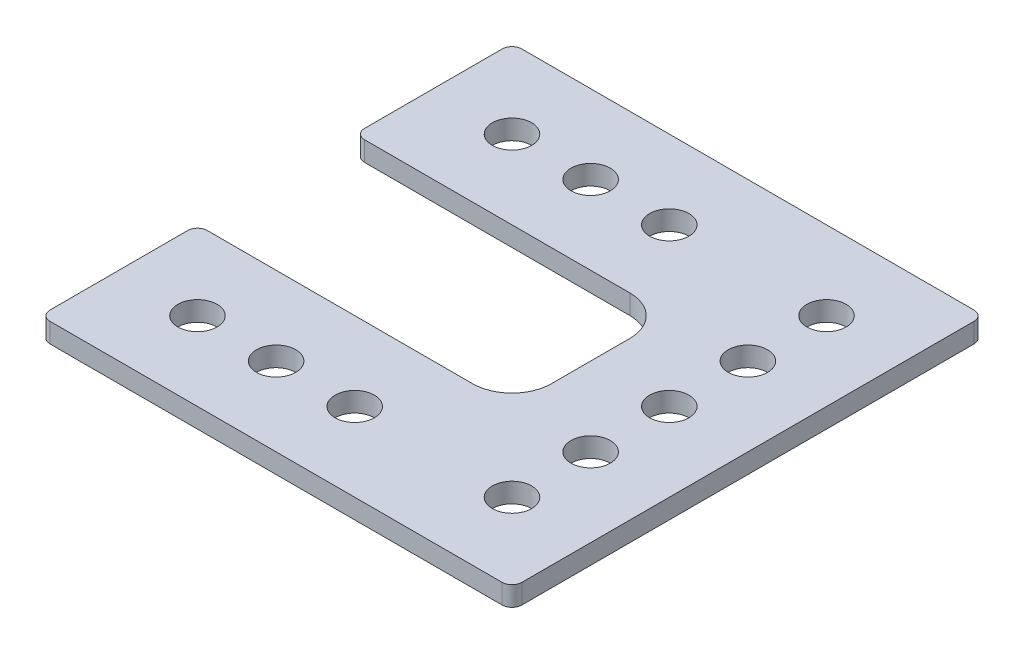
ISO-10303-21;
HEADER;
FILE_DESCRIPTION(('STEP AP214'),'2;1');
FILE_NAME('part.step','',(''),(''),'','','');
FILE_SCHEMA(('AUTOMOTIVE_DESIGN { 1 0 10303 214 1 1 1 1 }'));
ENDSEC;
DATA;
#1=APPLICATION_CONTEXT('core data for automotive mechanical design processes');
#2=APPLICATION_PROTOCOL_DEFINITION('international standard','automotive_design',2000,#1);
#3=PRODUCT_CONTEXT('',#1,'mechanical');
#4=PRODUCT('Part','Part','',(#3));
#5=PRODUCT_RELATED_PRODUCT_CATEGORY('part','',(#4));
#6=PRODUCT_DEFINITION_FORMATION('','',#4);
#7=PRODUCT_DEFINITION_CONTEXT('part definition',#1,'design');
#8=PRODUCT_DEFINITION('design','',#6,#7);
#9=PRODUCT_DEFINITION_SHAPE('','',#8);
#10=(LENGTH_UNIT() NAMED_UNIT(*) SI_UNIT(.MILLI.,.METRE.));
#11=(NAMED_UNIT(*) PLANE_ANGLE_UNIT() SI_UNIT($,.RADIAN.));
#12=(NAMED_UNIT(*) SI_UNIT($,.STERADIAN.) SOLID_ANGLE_UNIT());
#13=UNCERTAINTY_MEASURE_WITH_UNIT(LENGTH_MEASURE(1.E-05),#10,'distance_accuracy_value','');
#14=(GEOMETRIC_REPRESENTATION_CONTEXT(3) GLOBAL_UNCERTAINTY_ASSIGNED_CONTEXT((#13)) GLOBAL_UNIT_ASSIGNED_CONTEXT((#10,
#11,#12)) REPRESENTATION_CONTEXT('',''));
#15=CARTESIAN_POINT('',(0.,0.,0.));
#16=DIRECTION('',(0.,0.,1.));
#17=DIRECTION('',(1.,0.,0.));
#18=AXIS2_PLACEMENT_3D('',#15,#16,#17);
#19=CARTESIAN_POINT('',(12.7,3.175,38.1));
#20=DIRECTION('',(-1.,0.,0.));
#21=DIRECTION('',(0.,0.,1.));
#22=AXIS2_PLACEMENT_3D('',#19,#20,#21);
#23=PLANE('',#22);
#24=DIRECTION('',(0.,0.,-1.));
#25=VECTOR('',#24,1.);
#26=CARTESIAN_POINT('',(12.7,3.175,38.1));
#27=LINE('',#26,#25);
#28=CARTESIAN_POINT('',(12.7,3.175,36.5125));
#29=VERTEX_POINT('',#28);
#30=CARTESIAN_POINT('',(12.7,3.175,-36.5125));
#31=VERTEX_POINT('',#30);
#32=EDGE_CURVE('E166',#29,#31,#27,.T.);
#33=ORIENTED_EDGE('',*,*,#32,.F.);
#34=DIRECTION('',(0.,-1.,0.));
#35=VECTOR('',#34,1.);
#36=CARTESIAN_POINT('',(12.7,3.175,36.5125));
#37=LINE('',#36,#35);
#38=CARTESIAN_POINT('',(12.7,0.,36.5125));
#39=VERTEX_POINT('',#38);
#40=EDGE_CURVE('E152',#29,#39,#37,.T.);
#41=ORIENTED_EDGE('',*,*,#40,.T.);
#42=DIRECTION('',(0.,0.,-1.));
#43=VECTOR('',#42,1.);
#44=CARTESIAN_POINT('',(12.7,0.,38.1));
#45=LINE('',#44,#43);
#46=CARTESIAN_POINT('',(12.7,0.,-36.5125));
#47=VERTEX_POINT('',#46);
#48=EDGE_CURVE('E163',#39,#47,#45,.T.);
#49=ORIENTED_EDGE('',*,*,#48,.T.);
#50=DIRECTION('',(0.,-1.,0.));
#51=VECTOR('',#50,1.);
#52=CARTESIAN_POINT('',(12.7,3.175,-36.5125));
#53=LINE('',#52,#51);
#54=EDGE_CURVE('E168',#47,#31,#53,.F.);
#55=ORIENTED_EDGE('',*,*,#54,.T.);
#56=EDGE_LOOP('',(#33,#41,#49,#55));
#57=FACE_BOUND('',#56,.T.);
#58=ADVANCED_FACE('F35',(#57),#23,.F.);
#59=CARTESIAN_POINT('',(-63.5,3.175,-38.1));
#60=DIRECTION('',(0.,0.,1.));
#61=DIRECTION('',(1.,0.,0.));
#62=AXIS2_PLACEMENT_3D('',#59,#60,#61);
#63=PLANE('',#62);
#64=DIRECTION('',(-1.,0.,0.));
#65=VECTOR('',#64,1.);
#66=CARTESIAN_POINT('',(-12.7,3.175,-38.1));
#67=LINE('',#66,#65);
#68=CARTESIAN_POINT('',(11.1125,3.175,-38.1));
#69=VERTEX_POINT('',#68);
#70=CARTESIAN_POINT('',(-61.9125,3.175,-38.1));
#71=VERTEX_POINT('',#70);
#72=EDGE_CURVE('E289',#69,#71,#67,.T.);
#73=ORIENTED_EDGE('',*,*,#72,.F.);
#74=DIRECTION('',(0.,-1.,0.));
#75=VECTOR('',#74,1.);
#76=CARTESIAN_POINT('',(11.1125,3.175,-38.1));
#77=LINE('',#76,#75);
#78=CARTESIAN_POINT('',(11.1125,0.,-38.1));
#79=VERTEX_POINT('',#78);
#80=EDGE_CURVE('E226',#69,#79,#77,.T.);
#81=ORIENTED_EDGE('',*,*,#80,.T.);
#82=DIRECTION('',(-1.,0.,0.));
#83=VECTOR('',#82,1.);
#84=CARTESIAN_POINT('',(-63.5,0.,-38.1));
#85=LINE('',#84,#83);
#86=CARTESIAN_POINT('',(-61.9125,0.,-38.1));
#87=VERTEX_POINT('',#86);
#88=EDGE_CURVE('E172',#79,#87,#85,.T.);
#89=ORIENTED_EDGE('',*,*,#88,.T.);
#90=DIRECTION('',(0.,-1.,0.));
#91=VECTOR('',#90,1.);
#92=CARTESIAN_POINT('',(-61.9125,3.175,-38.1));
#93=LINE('',#92,#91);
#94=EDGE_CURVE('E224',#87,#71,#93,.F.);
#95=ORIENTED_EDGE('',*,*,#94,.T.);
#96=EDGE_LOOP('',(#73,#81,#89,#95));
#97=FACE_BOUND('',#96,.T.);
#98=ADVANCED_FACE('F320',(#97),#63,.F.);
#99=CARTESIAN_POINT('',(-63.5,3.175,-12.7));
#100=DIRECTION('',(1.,0.,0.));
#101=DIRECTION('',(0.,0.,-1.));
#102=AXIS2_PLACEMENT_3D('',#99,#100,#101);
#103=PLANE('',#102);
#104=DIRECTION('',(0.,0.,1.));
#105=VECTOR('',#104,1.);
#106=CARTESIAN_POINT('',(-63.5,3.175,-12.7));
#107=LINE('',#106,#105);
#108=CARTESIAN_POINT('',(-63.5,3.175,-36.5125));
#109=VERTEX_POINT('',#108);
#110=CARTESIAN_POINT('',(-63.5,3.175,-14.2875));
#111=VERTEX_POINT('',#110);
#112=EDGE_CURVE('E286',#109,#111,#107,.T.);
#113=ORIENTED_EDGE('',*,*,#112,.F.);
#114=DIRECTION('',(0.,-1.,0.));
#115=VECTOR('',#114,1.);
#116=CARTESIAN_POINT('',(-63.5,3.175,-36.5125));
#117=LINE('',#116,#115);
#118=CARTESIAN_POINT('',(-63.5,0.,-36.5125));
#119=VERTEX_POINT('',#118);
#120=EDGE_CURVE('E231',#109,#119,#117,.T.);
#121=ORIENTED_EDGE('',*,*,#120,.T.);
#122=DIRECTION('',(0.,0.,1.));
#123=VECTOR('',#122,1.);
#124=CARTESIAN_POINT('',(-63.5,0.,-12.7));
#125=LINE('',#124,#123);
#126=CARTESIAN_POINT('',(-63.5,0.,-14.2875));
#127=VERTEX_POINT('',#126);
#128=EDGE_CURVE('E176',#119,#127,#125,.T.);
#129=ORIENTED_EDGE('',*,*,#128,.T.);
#130=DIRECTION('',(0.,-1.,0.));
#131=VECTOR('',#130,1.);
#132=CARTESIAN_POINT('',(-63.5,3.175,-14.2875));
#133=LINE('',#132,#131);
#134=EDGE_CURVE('E229',#127,#111,#133,.F.);
#135=ORIENTED_EDGE('',*,*,#134,.T.);
#136=EDGE_LOOP('',(#113,#121,#129,#135));
#137=FACE_BOUND('',#136,.T.);
#138=ADVANCED_FACE('F325',(#137),#103,.F.);
#139=CARTESIAN_POINT('',(-63.5,3.175,-12.7));
#140=DIRECTION('',(0.,0.,-1.));
#141=DIRECTION('',(-1.,0.,0.));
#142=AXIS2_PLACEMENT_3D('',#139,#140,#141);
#143=PLANE('',#142);
#144=DIRECTION('',(1.,0.,0.));
#145=VECTOR('',#144,1.);
#146=CARTESIAN_POINT('',(-63.5,0.,-12.7));
#147=LINE('',#146,#145);
#148=CARTESIAN_POINT('',(-61.9125,0.,-12.7));
#149=VERTEX_POINT('',#148);
#150=CARTESIAN_POINT('',(-19.05,0.,-12.7));
#151=VERTEX_POINT('',#150);
#152=EDGE_CURVE('E187',#149,#151,#147,.T.);
#153=ORIENTED_EDGE('',*,*,#152,.T.);
#154=DIRECTION('',(0.,-1.,0.));
#155=VECTOR('',#154,1.);
#156=CARTESIAN_POINT('',(-19.05,3.175,-12.7));
#157=LINE('',#156,#155);
#158=CARTESIAN_POINT('',(-19.05,3.175,-12.7));
#159=VERTEX_POINT('',#158);
#160=EDGE_CURVE('E56',#151,#159,#157,.F.);
#161=ORIENTED_EDGE('',*,*,#160,.T.);
#162=DIRECTION('',(1.,0.,0.));
#163=VECTOR('',#162,1.);
#164=CARTESIAN_POINT('',(-63.5,3.175,-12.7));
#165=LINE('',#164,#163);
#166=CARTESIAN_POINT('',(-61.9125,3.175,-12.7));
#167=VERTEX_POINT('',#166);
#168=EDGE_CURVE('E282',#167,#159,#165,.T.);
#169=ORIENTED_EDGE('',*,*,#168,.F.);
#170=DIRECTION('',(0.,-1.,0.));
#171=VECTOR('',#170,1.);
#172=CARTESIAN_POINT('',(-61.9125,3.175,-12.7));
#173=LINE('',#172,#171);
#174=EDGE_CURVE('E242',#167,#149,#173,.T.);
#175=ORIENTED_EDGE('',*,*,#174,.T.);
#176=EDGE_LOOP('',(#153,#161,#169,#175));
#177=FACE_BOUND('',#176,.T.);
#178=ADVANCED_FACE('F350',(#177),#143,.F.);
#179=CARTESIAN_POINT('',(-12.7,3.175,12.7));
#180=DIRECTION('',(1.,0.,0.));
#181=DIRECTION('',(0.,0.,-1.));
#182=AXIS2_PLACEMENT_3D('',#179,#180,#181);
#183=PLANE('',#182);
#184=DIRECTION('',(0.,0.,1.));
#185=VECTOR('',#184,1.);
#186=CARTESIAN_POINT('',(-12.7,0.,12.7));
#187=LINE('',#186,#185);
#188=CARTESIAN_POINT('',(-12.7,0.,-6.35000000000001));
#189=VERTEX_POINT('',#188);
#190=CARTESIAN_POINT('',(-12.7,0.,6.34999999999998));
#191=VERTEX_POINT('',#190);
#192=EDGE_CURVE('E189',#189,#191,#187,.T.);
#193=ORIENTED_EDGE('',*,*,#192,.T.);
#194=DIRECTION('',(0.,-1.,0.));
#195=VECTOR('',#194,1.);
#196=CARTESIAN_POINT('',(-12.7,3.175,6.34999999999998));
#197=LINE('',#196,#195);
#198=CARTESIAN_POINT('',(-12.7,3.175,6.34999999999998));
#199=VERTEX_POINT('',#198);
#200=EDGE_CURVE('E251',#191,#199,#197,.F.);
#201=ORIENTED_EDGE('',*,*,#200,.T.);
#202=DIRECTION('',(0.,0.,1.));
#203=VECTOR('',#202,1.);
#204=CARTESIAN_POINT('',(-12.7,3.175,12.7));
#205=LINE('',#204,#203);
#206=CARTESIAN_POINT('',(-12.7,3.175,-6.35000000000001));
#207=VERTEX_POINT('',#206);
#208=EDGE_CURVE('E265',#207,#199,#205,.T.);
#209=ORIENTED_EDGE('',*,*,#208,.F.);
#210=DIRECTION('',(0.,-1.,0.));
#211=VECTOR('',#210,1.);
#212=CARTESIAN_POINT('',(-12.7,0.,-6.35000000000001));
#213=LINE('',#212,#211);
#214=EDGE_CURVE('E248',#207,#189,#213,.T.);
#215=ORIENTED_EDGE('',*,*,#214,.T.);
#216=EDGE_LOOP('',(#193,#201,#209,#215));
#217=FACE_BOUND('',#216,.T.);
#218=ADVANCED_FACE('F278',(#217),#183,.F.);
#219=CARTESIAN_POINT('',(-63.5,3.175,12.7));
#220=DIRECTION('',(0.,0.,1.));
#221=DIRECTION('',(1.,0.,0.));
#222=AXIS2_PLACEMENT_3D('',#219,#220,#221);
#223=PLANE('',#222);
#224=DIRECTION('',(-1.,0.,0.));
#225=VECTOR('',#224,1.);
#226=CARTESIAN_POINT('',(-63.5,3.175,12.7));
#227=LINE('',#226,#225);
#228=CARTESIAN_POINT('',(-19.05,3.175,12.7));
#229=VERTEX_POINT('',#228);
#230=CARTESIAN_POINT('',(-61.9125,3.175,12.7));
#231=VERTEX_POINT('',#230);
#232=EDGE_CURVE('E263',#229,#231,#227,.T.);
#233=ORIENTED_EDGE('',*,*,#232,.F.);
#234=DIRECTION('',(0.,-1.,0.));
#235=VECTOR('',#234,1.);
#236=CARTESIAN_POINT('',(-19.05,0.,12.7));
#237=LINE('',#236,#235);
#238=CARTESIAN_POINT('',(-19.05,0.,12.7));
#239=VERTEX_POINT('',#238);
#240=EDGE_CURVE('E245',#229,#239,#237,.T.);
#241=ORIENTED_EDGE('',*,*,#240,.T.);
#242=DIRECTION('',(-1.,0.,0.));
#243=VECTOR('',#242,1.);
#244=CARTESIAN_POINT('',(-63.5,0.,12.7));
#245=LINE('',#244,#243);
#246=CARTESIAN_POINT('',(-61.9125,0.,12.7));
#247=VERTEX_POINT('',#246);
#248=EDGE_CURVE('E192',#239,#247,#245,.T.);
#249=ORIENTED_EDGE('',*,*,#248,.T.);
#250=DIRECTION('',(0.,-1.,0.));
#251=VECTOR('',#250,1.);
#252=CARTESIAN_POINT('',(-61.9125,3.175,12.7));
#253=LINE('',#252,#251);
#254=EDGE_CURVE('E239',#247,#231,#253,.F.);
#255=ORIENTED_EDGE('',*,*,#254,.T.);
#256=EDGE_LOOP('',(#233,#241,#249,#255));
#257=FACE_BOUND('',#256,.T.);
#258=ADVANCED_FACE('F270',(#257),#223,.F.);
#259=CARTESIAN_POINT('',(-63.5,3.175,12.7));
#260=DIRECTION('',(1.,0.,0.));
#261=DIRECTION('',(0.,0.,-1.));
#262=AXIS2_PLACEMENT_3D('',#259,#260,#261);
#263=PLANE('',#262);
#264=DIRECTION('',(0.,0.,1.));
#265=VECTOR('',#264,1.);
#266=CARTESIAN_POINT('',(-63.5,0.,12.7));
#267=LINE('',#266,#265);
#268=CARTESIAN_POINT('',(-63.5,0.,14.2875));
#269=VERTEX_POINT('',#268);
#270=CARTESIAN_POINT('',(-63.5,0.,36.5125));
#271=VERTEX_POINT('',#270);
#272=EDGE_CURVE('E194',#269,#271,#267,.T.);
#273=ORIENTED_EDGE('',*,*,#272,.T.);
#274=DIRECTION('',(0.,-1.,0.));
#275=VECTOR('',#274,1.);
#276=CARTESIAN_POINT('',(-63.5,3.175,36.5125));
#277=LINE('',#276,#275);
#278=CARTESIAN_POINT('',(-63.5,3.175,36.5125));
#279=VERTEX_POINT('',#278);
#280=EDGE_CURVE('E237',#271,#279,#277,.F.);
#281=ORIENTED_EDGE('',*,*,#280,.T.);
#282=DIRECTION('',(0.,0.,1.));
#283=VECTOR('',#282,1.);
#284=CARTESIAN_POINT('',(-63.5,3.175,12.7));
#285=LINE('',#284,#283);
#286=CARTESIAN_POINT('',(-63.5,3.175,14.2875));
#287=VERTEX_POINT('',#286);
#288=EDGE_CURVE('E274',#287,#279,#285,.T.);
#289=ORIENTED_EDGE('',*,*,#288,.F.);
#290=DIRECTION('',(0.,-1.,0.));
#291=VECTOR('',#290,1.);
#292=CARTESIAN_POINT('',(-63.5,3.175,14.2875));
#293=LINE('',#292,#291);
#294=EDGE_CURVE('E234',#287,#269,#293,.T.);
#295=ORIENTED_EDGE('',*,*,#294,.T.);
#296=EDGE_LOOP('',(#273,#281,#289,#295));
#297=FACE_BOUND('',#296,.T.);
#298=ADVANCED_FACE('F304',(#297),#263,.F.);
#299=CARTESIAN_POINT('',(-12.7,3.175,38.1));
#300=DIRECTION('',(0.,0.,-1.));
#301=DIRECTION('',(-1.,0.,0.));
#302=AXIS2_PLACEMENT_3D('',#299,#300,#301);
#303=PLANE('',#302);
#304=DIRECTION('',(1.,0.,0.));
#305=VECTOR('',#304,1.);
#306=CARTESIAN_POINT('',(-12.7,0.,38.1));
#307=LINE('',#306,#305);
#308=CARTESIAN_POINT('',(-61.9125,0.,38.1));
#309=VERTEX_POINT('',#308);
#310=CARTESIAN_POINT('',(11.1125,0.,38.1));
#311=VERTEX_POINT('',#310);
#312=EDGE_CURVE('E197',#309,#311,#307,.T.);
#313=ORIENTED_EDGE('',*,*,#312,.T.);
#314=DIRECTION('',(0.,-1.,0.));
#315=VECTOR('',#314,1.);
#316=CARTESIAN_POINT('',(11.1125,3.175,38.1));
#317=LINE('',#316,#315);
#318=CARTESIAN_POINT('',(11.1125,3.175,38.1));
#319=VERTEX_POINT('',#318);
#320=EDGE_CURVE('E153',#311,#319,#317,.F.);
#321=ORIENTED_EDGE('',*,*,#320,.T.);
#322=DIRECTION('',(1.,0.,0.));
#323=VECTOR('',#322,1.);
#324=CARTESIAN_POINT('',(-63.5,3.175,38.1));
#325=LINE('',#324,#323);
#326=CARTESIAN_POINT('',(-61.9125,3.175,38.1));
#327=VERTEX_POINT('',#326);
#328=EDGE_CURVE('E182',#327,#319,#325,.T.);
#329=ORIENTED_EDGE('',*,*,#328,.F.);
#330=DIRECTION('',(0.,-1.,0.));
#331=VECTOR('',#330,1.);
#332=CARTESIAN_POINT('',(-61.9125,3.175,38.1));
#333=LINE('',#332,#331);
#334=EDGE_CURVE('E157',#327,#309,#333,.T.);
#335=ORIENTED_EDGE('',*,*,#334,.T.);
#336=EDGE_LOOP('',(#313,#321,#329,#335));
#337=FACE_BOUND('',#336,.T.);
#338=ADVANCED_FACE('F298',(#337),#303,.F.);
#339=CARTESIAN_POINT('',(0.,3.175,0.));
#340=DIRECTION('',(0.,-1.,0.));
#341=DIRECTION('',(0.,0.,-1.));
#342=AXIS2_PLACEMENT_3D('',#339,#340,#341);
#343=PLANE('',#342);
#344=CARTESIAN_POINT('',(-50.8,3.175,25.4));
#345=DIRECTION('',(0.,1.,0.));
#346=DIRECTION('',(0.,0.,-1.));
#347=AXIS2_PLACEMENT_3D('',#344,#345,#346);
#348=CIRCLE('',#347,3.175);
#349=CARTESIAN_POINT('',(-50.8,3.175,22.225));
#350=VERTEX_POINT('',#349);
#351=EDGE_CURVE('E412',#350,#350,#348,.T.);
#352=ORIENTED_EDGE('',*,*,#351,.F.);
#353=EDGE_LOOP('',(#352));
#354=FACE_BOUND('',#353,.T.);
#355=CARTESIAN_POINT('',(-38.1,3.175,25.4));
#356=DIRECTION('',(0.,1.,0.));
#357=DIRECTION('',(0.,0.,-1.));
#358=AXIS2_PLACEMENT_3D('',#355,#356,#357);
#359=CIRCLE('',#358,3.175);
#360=CARTESIAN_POINT('',(-38.1,3.175,22.225));
#361=VERTEX_POINT('',#360);
#362=EDGE_CURVE('E406',#361,#361,#359,.T.);
#363=ORIENTED_EDGE('',*,*,#362,.F.);
#364=EDGE_LOOP('',(#363));
#365=FACE_BOUND('',#364,.T.);
#366=CARTESIAN_POINT('',(-25.4,3.175,-25.4));
#367=DIRECTION('',(0.,1.,0.));
#368=DIRECTION('',(0.,0.,1.));
#369=AXIS2_PLACEMENT_3D('',#366,#367,#368);
#370=CIRCLE('',#369,3.175);
#371=CARTESIAN_POINT('',(-25.4,3.175,-22.225));
#372=VERTEX_POINT('',#371);
#373=EDGE_CURVE('E400',#372,#372,#370,.T.);
#374=ORIENTED_EDGE('',*,*,#373,.F.);
#375=EDGE_LOOP('',(#374));
#376=FACE_BOUND('',#375,.T.);
#377=CARTESIAN_POINT('',(-38.1,3.175,-25.4));
#378=DIRECTION('',(0.,1.,0.));
#379=DIRECTION('',(0.,0.,1.));
#380=AXIS2_PLACEMENT_3D('',#377,#378,#379);
#381=CIRCLE('',#380,3.175);
#382=CARTESIAN_POINT('',(-38.1,3.175,-22.225));
#383=VERTEX_POINT('',#382);
#384=EDGE_CURVE('E394',#383,#383,#381,.T.);
#385=ORIENTED_EDGE('',*,*,#384,.F.);
#386=EDGE_LOOP('',(#385));
#387=FACE_BOUND('',#386,.T.);
#388=CARTESIAN_POINT('',(-25.4,3.175,25.4));
#389=DIRECTION('',(0.,1.,0.));
#390=DIRECTION('',(0.,0.,-1.));
#391=AXIS2_PLACEMENT_3D('',#388,#389,#390);
#392=CIRCLE('',#391,3.175);
#393=CARTESIAN_POINT('',(-25.4,3.175,22.225));
#394=VERTEX_POINT('',#393);
#395=EDGE_CURVE('E388',#394,#394,#392,.T.);
#396=ORIENTED_EDGE('',*,*,#395,.F.);
#397=EDGE_LOOP('',(#396));
#398=FACE_BOUND('',#397,.T.);
#399=CARTESIAN_POINT('',(-50.8,3.175,-25.4));
#400=DIRECTION('',(0.,1.,0.));
#401=DIRECTION('',(0.,0.,1.));
#402=AXIS2_PLACEMENT_3D('',#399,#400,#401);
#403=CIRCLE('',#402,3.175);
#404=CARTESIAN_POINT('',(-50.8,3.175,-22.225));
#405=VERTEX_POINT('',#404);
#406=EDGE_CURVE('E382',#405,#405,#403,.T.);
#407=ORIENTED_EDGE('',*,*,#406,.F.);
#408=EDGE_LOOP('',(#407));
#409=FACE_BOUND('',#408,.T.);
#410=CARTESIAN_POINT('',(0.,3.175,12.7));
#411=DIRECTION('',(0.,1.,0.));
#412=DIRECTION('',(0.,0.,-1.));
#413=AXIS2_PLACEMENT_3D('',#410,#411,#412);
#414=CIRCLE('',#413,3.175);
#415=CARTESIAN_POINT('',(0.,3.175,9.52499999999997));
#416=VERTEX_POINT('',#415);
#417=EDGE_CURVE('E376',#416,#416,#414,.T.);
#418=ORIENTED_EDGE('',*,*,#417,.F.);
#419=EDGE_LOOP('',(#418));
#420=FACE_BOUND('',#419,.T.);
#421=CARTESIAN_POINT('',(0.,3.175,25.4));
#422=DIRECTION('',(0.,1.,0.));
#423=DIRECTION('',(0.,0.,-1.));
#424=AXIS2_PLACEMENT_3D('',#421,#422,#423);
#425=CIRCLE('',#424,3.175);
#426=CARTESIAN_POINT('',(0.,3.175,22.225));
#427=VERTEX_POINT('',#426);
#428=EDGE_CURVE('E370',#427,#427,#425,.T.);
#429=ORIENTED_EDGE('',*,*,#428,.F.);
#430=EDGE_LOOP('',(#429));
#431=FACE_BOUND('',#430,.T.);
#432=CARTESIAN_POINT('',(0.,3.175,-25.4));
#433=DIRECTION('',(0.,1.,0.));
#434=DIRECTION('',(0.,0.,1.));
#435=AXIS2_PLACEMENT_3D('',#432,#433,#434);
#436=CIRCLE('',#435,3.175);
#437=CARTESIAN_POINT('',(0.,3.175,-22.225));
#438=VERTEX_POINT('',#437);
#439=EDGE_CURVE('E364',#438,#438,#436,.T.);
#440=ORIENTED_EDGE('',*,*,#439,.F.);
#441=EDGE_LOOP('',(#440));
#442=FACE_BOUND('',#441,.T.);
#443=CARTESIAN_POINT('',(0.,3.175,-12.7));
#444=DIRECTION('',(0.,1.,0.));
#445=DIRECTION('',(0.,0.,1.));
#446=AXIS2_PLACEMENT_3D('',#443,#444,#445);
#447=CIRCLE('',#446,3.175);
#448=CARTESIAN_POINT('',(0.,3.175,-9.525));
#449=VERTEX_POINT('',#448);
#450=EDGE_CURVE('E358',#449,#449,#447,.T.);
#451=ORIENTED_EDGE('',*,*,#450,.F.);
#452=EDGE_LOOP('',(#451));
#453=FACE_BOUND('',#452,.T.);
#454=CARTESIAN_POINT('',(0.,3.175,0.));
#455=DIRECTION('',(0.,1.,0.));
#456=DIRECTION('',(0.,0.,1.));
#457=AXIS2_PLACEMENT_3D('',#454,#455,#456);
#458=CIRCLE('',#457,3.175);
#459=CARTESIAN_POINT('',(0.,3.175,3.175));
#460=VERTEX_POINT('',#459);
#461=EDGE_CURVE('E179',#460,#460,#458,.T.);
#462=ORIENTED_EDGE('',*,*,#461,.F.);
#463=EDGE_LOOP('',(#462));
#464=FACE_BOUND('',#463,.T.);
#465=ORIENTED_EDGE('',*,*,#328,.T.);
#466=CARTESIAN_POINT('',(11.1125,3.175,36.5125));
#467=DIRECTION('',(0.,-1.,0.));
#468=DIRECTION('',(0.,0.,-1.));
#469=AXIS2_PLACEMENT_3D('',#466,#467,#468);
#470=CIRCLE('',#469,1.5875);
#471=EDGE_CURVE('E222',#319,#29,#470,.F.);
#472=ORIENTED_EDGE('',*,*,#471,.T.);
#473=ORIENTED_EDGE('',*,*,#32,.T.);
#474=CARTESIAN_POINT('',(11.1125,3.175,-36.5125));
#475=DIRECTION('',(0.,-1.,0.));
#476=DIRECTION('',(0.,0.,-1.));
#477=AXIS2_PLACEMENT_3D('',#474,#475,#476);
#478=CIRCLE('',#477,1.5875);
#479=EDGE_CURVE('E220',#31,#69,#478,.F.);
#480=ORIENTED_EDGE('',*,*,#479,.T.);
#481=ORIENTED_EDGE('',*,*,#72,.T.);
#482=CARTESIAN_POINT('',(-61.9125,3.175,-36.5125));
#483=DIRECTION('',(0.,-1.,0.));
#484=DIRECTION('',(0.,0.,-1.));
#485=AXIS2_PLACEMENT_3D('',#482,#483,#484);
#486=CIRCLE('',#485,1.5875);
#487=EDGE_CURVE('E218',#71,#109,#486,.F.);
#488=ORIENTED_EDGE('',*,*,#487,.T.);
#489=ORIENTED_EDGE('',*,*,#112,.T.);
#490=CARTESIAN_POINT('',(-61.9125,3.175,-14.2875));
#491=DIRECTION('',(0.,-1.,0.));
#492=DIRECTION('',(0.,0.,-1.));
#493=AXIS2_PLACEMENT_3D('',#490,#491,#492);
#494=CIRCLE('',#493,1.5875);
#495=EDGE_CURVE('E212',#111,#167,#494,.F.);
#496=ORIENTED_EDGE('',*,*,#495,.T.);
#497=ORIENTED_EDGE('',*,*,#168,.T.);
#498=CARTESIAN_POINT('',(-19.05,3.175,-6.35000000000001));
#499=DIRECTION('',(0.,-1.,0.));
#500=DIRECTION('',(0.,0.,-1.));
#501=AXIS2_PLACEMENT_3D('',#498,#499,#500);
#502=CIRCLE('',#501,6.35);
#503=EDGE_CURVE('E11',#159,#207,#502,.T.);
#504=ORIENTED_EDGE('',*,*,#503,.T.);
#505=ORIENTED_EDGE('',*,*,#208,.T.);
#506=CARTESIAN_POINT('',(-19.05,3.175,6.34999999999998));
#507=DIRECTION('',(0.,-1.,0.));
#508=DIRECTION('',(0.,0.,-1.));
#509=AXIS2_PLACEMENT_3D('',#506,#507,#508);
#510=CIRCLE('',#509,6.35);
#511=EDGE_CURVE('E256',#199,#229,#510,.T.);
#512=ORIENTED_EDGE('',*,*,#511,.T.);
#513=ORIENTED_EDGE('',*,*,#232,.T.);
#514=CARTESIAN_POINT('',(-61.9125,3.175,14.2875));
#515=DIRECTION('',(0.,-1.,0.));
#516=DIRECTION('',(0.,0.,-1.));
#517=AXIS2_PLACEMENT_3D('',#514,#515,#516);
#518=CIRCLE('',#517,1.5875);
#519=EDGE_CURVE('E214',#231,#287,#518,.F.);
#520=ORIENTED_EDGE('',*,*,#519,.T.);
#521=ORIENTED_EDGE('',*,*,#288,.T.);
#522=CARTESIAN_POINT('',(-61.9125,3.175,36.5125));
#523=DIRECTION('',(0.,-1.,0.));
#524=DIRECTION('',(0.,0.,-1.));
#525=AXIS2_PLACEMENT_3D('',#522,#523,#524);
#526=CIRCLE('',#525,1.5875);
#527=EDGE_CURVE('E216',#279,#327,#526,.F.);
#528=ORIENTED_EDGE('',*,*,#527,.T.);
#529=EDGE_LOOP('',(#465,#472,#473,#480,#481,#488,#489,#496,#497,#504,#505,#512,#513,#520,#521,#528));
#530=FACE_BOUND('',#529,.T.);
#531=ADVANCED_FACE('F262',(#354,#365,#376,#387,#398,#409,#420,#431,#442,#453,#464,#530),#343,.F.);
#532=CARTESIAN_POINT('',(0.,0.,0.));
#533=DIRECTION('',(0.,-1.,0.));
#534=DIRECTION('',(0.,0.,-1.));
#535=AXIS2_PLACEMENT_3D('',#532,#533,#534);
#536=PLANE('',#535);
#537=CARTESIAN_POINT('',(-50.8,0.,25.4));
#538=DIRECTION('',(0.,1.,0.));
#539=DIRECTION('',(0.,0.,-1.));
#540=AXIS2_PLACEMENT_3D('',#537,#538,#539);
#541=CIRCLE('',#540,3.175);
#542=CARTESIAN_POINT('',(-50.8,0.,22.225));
#543=VERTEX_POINT('',#542);
#544=EDGE_CURVE('E409',#543,#543,#541,.T.);
#545=ORIENTED_EDGE('',*,*,#544,.T.);
#546=EDGE_LOOP('',(#545));
#547=FACE_BOUND('',#546,.T.);
#548=CARTESIAN_POINT('',(-38.1,0.,25.4));
#549=DIRECTION('',(0.,1.,0.));
#550=DIRECTION('',(0.,0.,-1.));
#551=AXIS2_PLACEMENT_3D('',#548,#549,#550);
#552=CIRCLE('',#551,3.175);
#553=CARTESIAN_POINT('',(-38.1,0.,22.225));
#554=VERTEX_POINT('',#553);
#555=EDGE_CURVE('E403',#554,#554,#552,.T.);
#556=ORIENTED_EDGE('',*,*,#555,.T.);
#557=EDGE_LOOP('',(#556));
#558=FACE_BOUND('',#557,.T.);
#559=CARTESIAN_POINT('',(-25.4,0.,-25.4));
#560=DIRECTION('',(0.,1.,0.));
#561=DIRECTION('',(0.,0.,1.));
#562=AXIS2_PLACEMENT_3D('',#559,#560,#561);
#563=CIRCLE('',#562,3.175);
#564=CARTESIAN_POINT('',(-25.4,0.,-22.225));
#565=VERTEX_POINT('',#564);
#566=EDGE_CURVE('E397',#565,#565,#563,.T.);
#567=ORIENTED_EDGE('',*,*,#566,.T.);
#568=EDGE_LOOP('',(#567));
#569=FACE_BOUND('',#568,.T.);
#570=CARTESIAN_POINT('',(-38.1,0.,-25.4));
#571=DIRECTION('',(0.,1.,0.));
#572=DIRECTION('',(0.,0.,1.));
#573=AXIS2_PLACEMENT_3D('',#570,#571,#572);
#574=CIRCLE('',#573,3.175);
#575=CARTESIAN_POINT('',(-38.1,0.,-22.225));
#576=VERTEX_POINT('',#575);
#577=EDGE_CURVE('E391',#576,#576,#574,.T.);
#578=ORIENTED_EDGE('',*,*,#577,.T.);
#579=EDGE_LOOP('',(#578));
#580=FACE_BOUND('',#579,.T.);
#581=CARTESIAN_POINT('',(-25.4,0.,25.4));
#582=DIRECTION('',(0.,1.,0.));
#583=DIRECTION('',(0.,0.,-1.));
#584=AXIS2_PLACEMENT_3D('',#581,#582,#583);
#585=CIRCLE('',#584,3.175);
#586=CARTESIAN_POINT('',(-25.4,0.,22.225));
#587=VERTEX_POINT('',#586);
#588=EDGE_CURVE('E385',#587,#587,#585,.T.);
#589=ORIENTED_EDGE('',*,*,#588,.T.);
#590=EDGE_LOOP('',(#589));
#591=FACE_BOUND('',#590,.T.);
#592=CARTESIAN_POINT('',(-50.8,0.,-25.4));
#593=DIRECTION('',(0.,1.,0.));
#594=DIRECTION('',(0.,0.,1.));
#595=AXIS2_PLACEMENT_3D('',#592,#593,#594);
#596=CIRCLE('',#595,3.175);
#597=CARTESIAN_POINT('',(-50.8,0.,-22.225));
#598=VERTEX_POINT('',#597);
#599=EDGE_CURVE('E379',#598,#598,#596,.T.);
#600=ORIENTED_EDGE('',*,*,#599,.T.);
#601=EDGE_LOOP('',(#600));
#602=FACE_BOUND('',#601,.T.);
#603=CARTESIAN_POINT('',(0.,0.,12.7));
#604=DIRECTION('',(0.,1.,0.));
#605=DIRECTION('',(0.,0.,-1.));
#606=AXIS2_PLACEMENT_3D('',#603,#604,#605);
#607=CIRCLE('',#606,3.175);
#608=CARTESIAN_POINT('',(0.,0.,9.52499999999997));
#609=VERTEX_POINT('',#608);
#610=EDGE_CURVE('E373',#609,#609,#607,.T.);
#611=ORIENTED_EDGE('',*,*,#610,.T.);
#612=EDGE_LOOP('',(#611));
#613=FACE_BOUND('',#612,.T.);
#614=CARTESIAN_POINT('',(0.,0.,25.4));
#615=DIRECTION('',(0.,1.,0.));
#616=DIRECTION('',(0.,0.,-1.));
#617=AXIS2_PLACEMENT_3D('',#614,#615,#616);
#618=CIRCLE('',#617,3.175);
#619=CARTESIAN_POINT('',(0.,0.,22.225));
#620=VERTEX_POINT('',#619);
#621=EDGE_CURVE('E367',#620,#620,#618,.T.);
#622=ORIENTED_EDGE('',*,*,#621,.T.);
#623=EDGE_LOOP('',(#622));
#624=FACE_BOUND('',#623,.T.);
#625=CARTESIAN_POINT('',(0.,0.,-25.4));
#626=DIRECTION('',(0.,1.,0.));
#627=DIRECTION('',(0.,0.,1.));
#628=AXIS2_PLACEMENT_3D('',#625,#626,#627);
#629=CIRCLE('',#628,3.175);
#630=CARTESIAN_POINT('',(0.,0.,-22.225));
#631=VERTEX_POINT('',#630);
#632=EDGE_CURVE('E361',#631,#631,#629,.T.);
#633=ORIENTED_EDGE('',*,*,#632,.T.);
#634=EDGE_LOOP('',(#633));
#635=FACE_BOUND('',#634,.T.);
#636=CARTESIAN_POINT('',(0.,0.,-12.7));
#637=DIRECTION('',(0.,1.,0.));
#638=DIRECTION('',(0.,0.,1.));
#639=AXIS2_PLACEMENT_3D('',#636,#637,#638);
#640=CIRCLE('',#639,3.175);
#641=CARTESIAN_POINT('',(0.,0.,-9.525));
#642=VERTEX_POINT('',#641);
#643=EDGE_CURVE('E356',#642,#642,#640,.T.);
#644=ORIENTED_EDGE('',*,*,#643,.T.);
#645=EDGE_LOOP('',(#644));
#646=FACE_BOUND('',#645,.T.);
#647=CARTESIAN_POINT('',(0.,0.,0.));
#648=DIRECTION('',(0.,1.,0.));
#649=DIRECTION('',(0.,0.,1.));
#650=AXIS2_PLACEMENT_3D('',#647,#648,#649);
#651=CIRCLE('',#650,3.175);
#652=CARTESIAN_POINT('',(0.,0.,3.175));
#653=VERTEX_POINT('',#652);
#654=EDGE_CURVE('E173',#653,#653,#651,.T.);
#655=ORIENTED_EDGE('',*,*,#654,.T.);
#656=EDGE_LOOP('',(#655));
#657=FACE_BOUND('',#656,.T.);
#658=ORIENTED_EDGE('',*,*,#48,.F.);
#659=CARTESIAN_POINT('',(11.1125,0.,36.5125));
#660=DIRECTION('',(0.,-1.,0.));
#661=DIRECTION('',(0.,0.,-1.));
#662=AXIS2_PLACEMENT_3D('',#659,#660,#661);
#663=CIRCLE('',#662,1.5875);
#664=EDGE_CURVE('E148',#39,#311,#663,.T.);
#665=ORIENTED_EDGE('',*,*,#664,.T.);
#666=ORIENTED_EDGE('',*,*,#312,.F.);
#667=CARTESIAN_POINT('',(-61.9125,0.,36.5125));
#668=DIRECTION('',(0.,-1.,0.));
#669=DIRECTION('',(0.,0.,-1.));
#670=AXIS2_PLACEMENT_3D('',#667,#668,#669);
#671=CIRCLE('',#670,1.5875);
#672=EDGE_CURVE('E204',#309,#271,#671,.T.);
#673=ORIENTED_EDGE('',*,*,#672,.T.);
#674=ORIENTED_EDGE('',*,*,#272,.F.);
#675=CARTESIAN_POINT('',(-61.9125,0.,14.2875));
#676=DIRECTION('',(0.,-1.,0.));
#677=DIRECTION('',(0.,0.,-1.));
#678=AXIS2_PLACEMENT_3D('',#675,#676,#677);
#679=CIRCLE('',#678,1.5875);
#680=EDGE_CURVE('E201',#269,#247,#679,.T.);
#681=ORIENTED_EDGE('',*,*,#680,.T.);
#682=ORIENTED_EDGE('',*,*,#248,.F.);
#683=CARTESIAN_POINT('',(-19.05,0.,6.34999999999998));
#684=DIRECTION('',(0.,-1.,0.));
#685=DIRECTION('',(0.,0.,-1.));
#686=AXIS2_PLACEMENT_3D('',#683,#684,#685);
#687=CIRCLE('',#686,6.35);
#688=EDGE_CURVE('E254',#239,#191,#687,.F.);
#689=ORIENTED_EDGE('',*,*,#688,.T.);
#690=ORIENTED_EDGE('',*,*,#192,.F.);
#691=CARTESIAN_POINT('',(-19.05,0.,-6.35000000000001));
#692=DIRECTION('',(0.,-1.,0.));
#693=DIRECTION('',(0.,0.,-1.));
#694=AXIS2_PLACEMENT_3D('',#691,#692,#693);
#695=CIRCLE('',#694,6.35);
#696=EDGE_CURVE('E43',#189,#151,#695,.F.);
#697=ORIENTED_EDGE('',*,*,#696,.T.);
#698=ORIENTED_EDGE('',*,*,#152,.F.);
#699=CARTESIAN_POINT('',(-61.9125,0.,-14.2875));
#700=DIRECTION('',(0.,-1.,0.));
#701=DIRECTION('',(0.,0.,-1.));
#702=AXIS2_PLACEMENT_3D('',#699,#700,#701);
#703=CIRCLE('',#702,1.5875);
#704=EDGE_CURVE('E167',#149,#127,#703,.T.);
#705=ORIENTED_EDGE('',*,*,#704,.T.);
#706=ORIENTED_EDGE('',*,*,#128,.F.);
#707=CARTESIAN_POINT('',(-61.9125,0.,-36.5125));
#708=DIRECTION('',(0.,-1.,0.));
#709=DIRECTION('',(0.,0.,-1.));
#710=AXIS2_PLACEMENT_3D('',#707,#708,#709);
#711=CIRCLE('',#710,1.5875);
#712=EDGE_CURVE('E206',#119,#87,#711,.T.);
#713=ORIENTED_EDGE('',*,*,#712,.T.);
#714=ORIENTED_EDGE('',*,*,#88,.F.);
#715=CARTESIAN_POINT('',(11.1125,0.,-36.5125));
#716=DIRECTION('',(0.,-1.,0.));
#717=DIRECTION('',(0.,0.,-1.));
#718=AXIS2_PLACEMENT_3D('',#715,#716,#717);
#719=CIRCLE('',#718,1.5875);
#720=EDGE_CURVE('E158',#79,#47,#719,.T.);
#721=ORIENTED_EDGE('',*,*,#720,.T.);
#722=EDGE_LOOP('',(#658,#665,#666,#673,#674,#681,#682,#689,#690,#697,#698,#705,#706,#713,#714,#721));
#723=FACE_BOUND('',#722,.T.);
#724=ADVANCED_FACE('F170',(#547,#558,#569,#580,#591,#602,#613,#624,#635,#646,#657,#723),#536,.T.);
#725=CARTESIAN_POINT('',(0.,0.,0.));
#726=DIRECTION('',(0.,1.,0.));
#727=DIRECTION('',(0.,0.,1.));
#728=AXIS2_PLACEMENT_3D('',#725,#726,#727);
#729=CYLINDRICAL_SURFACE('',#728,3.175);
#730=ORIENTED_EDGE('',*,*,#654,.F.);
#731=EDGE_LOOP('',(#730));
#732=FACE_BOUND('',#731,.T.);
#733=ORIENTED_EDGE('',*,*,#461,.T.);
#734=EDGE_LOOP('',(#733));
#735=FACE_BOUND('',#734,.T.);
#736=ADVANCED_FACE('F449',(#732,#735),#729,.F.);
#737=CARTESIAN_POINT('',(0.,0.,-12.7));
#738=DIRECTION('',(0.,1.,0.));
#739=DIRECTION('',(0.,0.,1.));
#740=AXIS2_PLACEMENT_3D('',#737,#738,#739);
#741=CYLINDRICAL_SURFACE('',#740,3.175);
#742=ORIENTED_EDGE('',*,*,#643,.F.);
#743=EDGE_LOOP('',(#742));
#744=FACE_BOUND('',#743,.T.);
#745=ORIENTED_EDGE('',*,*,#450,.T.);
#746=EDGE_LOOP('',(#745));
#747=FACE_BOUND('',#746,.T.);
#748=ADVANCED_FACE('F451',(#744,#747),#741,.F.);
#749=CARTESIAN_POINT('',(0.,0.,-25.4));
#750=DIRECTION('',(0.,1.,0.));
#751=DIRECTION('',(0.,0.,1.));
#752=AXIS2_PLACEMENT_3D('',#749,#750,#751);
#753=CYLINDRICAL_SURFACE('',#752,3.175);
#754=ORIENTED_EDGE('',*,*,#632,.F.);
#755=EDGE_LOOP('',(#754));
#756=FACE_BOUND('',#755,.T.);
#757=ORIENTED_EDGE('',*,*,#439,.T.);
#758=EDGE_LOOP('',(#757));
#759=FACE_BOUND('',#758,.T.);
#760=ADVANCED_FACE('F458',(#756,#759),#753,.F.);
#761=CARTESIAN_POINT('',(0.,0.,25.4));
#762=DIRECTION('',(0.,1.,0.));
#763=DIRECTION('',(0.,0.,1.));
#764=AXIS2_PLACEMENT_3D('',#761,#762,#763);
#765=CYLINDRICAL_SURFACE('',#764,3.175);
#766=ORIENTED_EDGE('',*,*,#621,.F.);
#767=EDGE_LOOP('',(#766));
#768=FACE_BOUND('',#767,.T.);
#769=ORIENTED_EDGE('',*,*,#428,.T.);
#770=EDGE_LOOP('',(#769));
#771=FACE_BOUND('',#770,.T.);
#772=ADVANCED_FACE('F610',(#768,#771),#765,.F.);
#773=CARTESIAN_POINT('',(0.,0.,12.7));
#774=DIRECTION('',(0.,1.,0.));
#775=DIRECTION('',(0.,0.,1.));
#776=AXIS2_PLACEMENT_3D('',#773,#774,#775);
#777=CYLINDRICAL_SURFACE('',#776,3.175);
#778=ORIENTED_EDGE('',*,*,#610,.F.);
#779=EDGE_LOOP('',(#778));
#780=FACE_BOUND('',#779,.T.);
#781=ORIENTED_EDGE('',*,*,#417,.T.);
#782=EDGE_LOOP('',(#781));
#783=FACE_BOUND('',#782,.T.);
#784=ADVANCED_FACE('F602',(#780,#783),#777,.F.);
#785=CARTESIAN_POINT('',(-50.8,0.,-25.4));
#786=DIRECTION('',(0.,1.,0.));
#787=DIRECTION('',(0.,0.,1.));
#788=AXIS2_PLACEMENT_3D('',#785,#786,#787);
#789=CYLINDRICAL_SURFACE('',#788,3.175);
#790=ORIENTED_EDGE('',*,*,#599,.F.);
#791=EDGE_LOOP('',(#790));
#792=FACE_BOUND('',#791,.T.);
#793=ORIENTED_EDGE('',*,*,#406,.T.);
#794=EDGE_LOOP('',(#793));
#795=FACE_BOUND('',#794,.T.);
#796=ADVANCED_FACE('F594',(#792,#795),#789,.F.);
#797=CARTESIAN_POINT('',(-25.4,0.,25.4));
#798=DIRECTION('',(0.,1.,0.));
#799=DIRECTION('',(0.,0.,1.));
#800=AXIS2_PLACEMENT_3D('',#797,#798,#799);
#801=CYLINDRICAL_SURFACE('',#800,3.175);
#802=ORIENTED_EDGE('',*,*,#588,.F.);
#803=EDGE_LOOP('',(#802));
#804=FACE_BOUND('',#803,.T.);
#805=ORIENTED_EDGE('',*,*,#395,.T.);
#806=EDGE_LOOP('',(#805));
#807=FACE_BOUND('',#806,.T.);
#808=ADVANCED_FACE('F586',(#804,#807),#801,.F.);
#809=CARTESIAN_POINT('',(-38.1,0.,-25.4));
#810=DIRECTION('',(0.,1.,0.));
#811=DIRECTION('',(0.,0.,1.));
#812=AXIS2_PLACEMENT_3D('',#809,#810,#811);
#813=CYLINDRICAL_SURFACE('',#812,3.175);
#814=ORIENTED_EDGE('',*,*,#577,.F.);
#815=EDGE_LOOP('',(#814));
#816=FACE_BOUND('',#815,.T.);
#817=ORIENTED_EDGE('',*,*,#384,.T.);
#818=EDGE_LOOP('',(#817));
#819=FACE_BOUND('',#818,.T.);
#820=ADVANCED_FACE('F578',(#816,#819),#813,.F.);
#821=CARTESIAN_POINT('',(-25.4,0.,-25.4));
#822=DIRECTION('',(0.,1.,0.));
#823=DIRECTION('',(0.,0.,1.));
#824=AXIS2_PLACEMENT_3D('',#821,#822,#823);
#825=CYLINDRICAL_SURFACE('',#824,3.175);
#826=ORIENTED_EDGE('',*,*,#566,.F.);
#827=EDGE_LOOP('',(#826));
#828=FACE_BOUND('',#827,.T.);
#829=ORIENTED_EDGE('',*,*,#373,.T.);
#830=EDGE_LOOP('',(#829));
#831=FACE_BOUND('',#830,.T.);
#832=ADVANCED_FACE('F570',(#828,#831),#825,.F.);
#833=CARTESIAN_POINT('',(-38.1,0.,25.4));
#834=DIRECTION('',(0.,1.,0.));
#835=DIRECTION('',(0.,0.,1.));
#836=AXIS2_PLACEMENT_3D('',#833,#834,#835);
#837=CYLINDRICAL_SURFACE('',#836,3.175);
#838=ORIENTED_EDGE('',*,*,#555,.F.);
#839=EDGE_LOOP('',(#838));
#840=FACE_BOUND('',#839,.T.);
#841=ORIENTED_EDGE('',*,*,#362,.T.);
#842=EDGE_LOOP('',(#841));
#843=FACE_BOUND('',#842,.T.);
#844=ADVANCED_FACE('F422',(#840,#843),#837,.F.);
#845=CARTESIAN_POINT('',(-50.8,0.,25.4));
#846=DIRECTION('',(0.,1.,0.));
#847=DIRECTION('',(0.,0.,1.));
#848=AXIS2_PLACEMENT_3D('',#845,#846,#847);
#849=CYLINDRICAL_SURFACE('',#848,3.175);
#850=ORIENTED_EDGE('',*,*,#544,.F.);
#851=EDGE_LOOP('',(#850));
#852=FACE_BOUND('',#851,.T.);
#853=ORIENTED_EDGE('',*,*,#351,.T.);
#854=EDGE_LOOP('',(#853));
#855=FACE_BOUND('',#854,.T.);
#856=ADVANCED_FACE('F333',(#852,#855),#849,.F.);
#857=CARTESIAN_POINT('',(11.1125,3.175,36.5125));
#858=DIRECTION('',(0.,-1.,0.));
#859=DIRECTION('',(0.,0.,-1.));
#860=AXIS2_PLACEMENT_3D('',#857,#858,#859);
#861=CYLINDRICAL_SURFACE('',#860,1.5875);
#862=ORIENTED_EDGE('',*,*,#471,.F.);
#863=ORIENTED_EDGE('',*,*,#320,.F.);
#864=ORIENTED_EDGE('',*,*,#664,.F.);
#865=ORIENTED_EDGE('',*,*,#40,.F.);
#866=EDGE_LOOP('',(#862,#863,#864,#865));
#867=FACE_BOUND('',#866,.T.);
#868=ADVANCED_FACE('F151',(#867),#861,.T.);
#869=CARTESIAN_POINT('',(11.1125,3.175,-36.5125));
#870=DIRECTION('',(0.,-1.,0.));
#871=DIRECTION('',(0.,0.,-1.));
#872=AXIS2_PLACEMENT_3D('',#869,#870,#871);
#873=CYLINDRICAL_SURFACE('',#872,1.5875);
#874=ORIENTED_EDGE('',*,*,#479,.F.);
#875=ORIENTED_EDGE('',*,*,#54,.F.);
#876=ORIENTED_EDGE('',*,*,#720,.F.);
#877=ORIENTED_EDGE('',*,*,#80,.F.);
#878=EDGE_LOOP('',(#874,#875,#876,#877));
#879=FACE_BOUND('',#878,.T.);
#880=ADVANCED_FACE('F332',(#879),#873,.T.);
#881=CARTESIAN_POINT('',(-61.9125,3.175,-36.5125));
#882=DIRECTION('',(0.,-1.,0.));
#883=DIRECTION('',(0.,0.,-1.));
#884=AXIS2_PLACEMENT_3D('',#881,#882,#883);
#885=CYLINDRICAL_SURFACE('',#884,1.5875);
#886=ORIENTED_EDGE('',*,*,#487,.F.);
#887=ORIENTED_EDGE('',*,*,#94,.F.);
#888=ORIENTED_EDGE('',*,*,#712,.F.);
#889=ORIENTED_EDGE('',*,*,#120,.F.);
#890=EDGE_LOOP('',(#886,#887,#888,#889));
#891=FACE_BOUND('',#890,.T.);
#892=ADVANCED_FACE('F317',(#891),#885,.T.);
#893=CARTESIAN_POINT('',(-61.9125,3.175,36.5125));
#894=DIRECTION('',(0.,-1.,0.));
#895=DIRECTION('',(0.,0.,-1.));
#896=AXIS2_PLACEMENT_3D('',#893,#894,#895);
#897=CYLINDRICAL_SURFACE('',#896,1.5875);
#898=ORIENTED_EDGE('',*,*,#527,.F.);
#899=ORIENTED_EDGE('',*,*,#280,.F.);
#900=ORIENTED_EDGE('',*,*,#672,.F.);
#901=ORIENTED_EDGE('',*,*,#334,.F.);
#902=EDGE_LOOP('',(#898,#899,#900,#901));
#903=FACE_BOUND('',#902,.T.);
#904=ADVANCED_FACE('F300',(#903),#897,.T.);
#905=CARTESIAN_POINT('',(-61.9125,3.175,14.2875));
#906=DIRECTION('',(0.,-1.,0.));
#907=DIRECTION('',(0.,0.,-1.));
#908=AXIS2_PLACEMENT_3D('',#905,#906,#907);
#909=CYLINDRICAL_SURFACE('',#908,1.5875);
#910=ORIENTED_EDGE('',*,*,#519,.F.);
#911=ORIENTED_EDGE('',*,*,#254,.F.);
#912=ORIENTED_EDGE('',*,*,#680,.F.);
#913=ORIENTED_EDGE('',*,*,#294,.F.);
#914=EDGE_LOOP('',(#910,#911,#912,#913));
#915=FACE_BOUND('',#914,.T.);
#916=ADVANCED_FACE('F307',(#915),#909,.T.);
#917=CARTESIAN_POINT('',(-61.9125,3.175,-14.2875));
#918=DIRECTION('',(0.,-1.,0.));
#919=DIRECTION('',(0.,0.,-1.));
#920=AXIS2_PLACEMENT_3D('',#917,#918,#919);
#921=CYLINDRICAL_SURFACE('',#920,1.5875);
#922=ORIENTED_EDGE('',*,*,#495,.F.);
#923=ORIENTED_EDGE('',*,*,#134,.F.);
#924=ORIENTED_EDGE('',*,*,#704,.F.);
#925=ORIENTED_EDGE('',*,*,#174,.F.);
#926=EDGE_LOOP('',(#922,#923,#924,#925));
#927=FACE_BOUND('',#926,.T.);
#928=ADVANCED_FACE('F309',(#927),#921,.T.);
#929=CARTESIAN_POINT('',(-19.05,3.175,6.34999999999998));
#930=DIRECTION('',(0.,1.,0.));
#931=DIRECTION('',(0.,0.,1.));
#932=AXIS2_PLACEMENT_3D('',#929,#930,#931);
#933=CYLINDRICAL_SURFACE('',#932,6.35);
#934=ORIENTED_EDGE('',*,*,#511,.F.);
#935=ORIENTED_EDGE('',*,*,#200,.F.);
#936=ORIENTED_EDGE('',*,*,#688,.F.);
#937=ORIENTED_EDGE('',*,*,#240,.F.);
#938=EDGE_LOOP('',(#934,#935,#936,#937));
#939=FACE_BOUND('',#938,.T.);
#940=ADVANCED_FACE('F276',(#939),#933,.F.);
#941=CARTESIAN_POINT('',(-19.05,3.175,-6.35000000000001));
#942=DIRECTION('',(0.,1.,0.));
#943=DIRECTION('',(0.,0.,1.));
#944=AXIS2_PLACEMENT_3D('',#941,#942,#943);
#945=CYLINDRICAL_SURFACE('',#944,6.35);
#946=ORIENTED_EDGE('',*,*,#503,.F.);
#947=ORIENTED_EDGE('',*,*,#160,.F.);
#948=ORIENTED_EDGE('',*,*,#696,.F.);
#949=ORIENTED_EDGE('',*,*,#214,.F.);
#950=EDGE_LOOP('',(#946,#947,#948,#949));
#951=FACE_BOUND('',#950,.T.);
#952=ADVANCED_FACE('F37',(#951),#945,.F.);
#953=CLOSED_SHELL('',(#58,#98,#138,#178,#218,#258,#298,#338,#531,#724,#736,#748,#760,#772,#784,
#796,#808,#820,#832,#844,#856,#868,#880,#892,#904,#916,#928,#940,#952));
#954=MANIFOLD_SOLID_BREP('B2',#953);
#955=ADVANCED_BREP_SHAPE_REPRESENTATION('',(#18,#954),#14);
#956=SHAPE_DEFINITION_REPRESENTATION(#9,#955);
ENDSEC;
END-ISO-10303-21;
